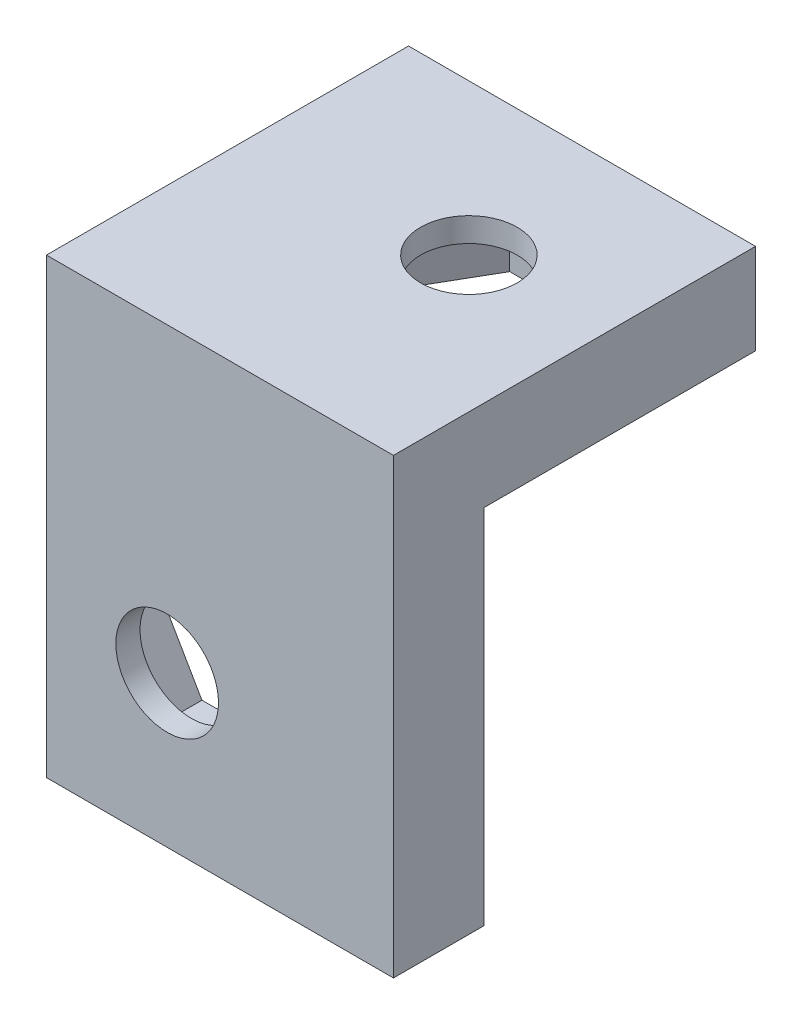
ISO-10303-21;
HEADER;
FILE_DESCRIPTION(('STEP AP214'),'2;1');
FILE_NAME('part.step','',(''),(''),'','','');
FILE_SCHEMA(('AUTOMOTIVE_DESIGN { 1 0 10303 214 1 1 1 1 }'));
ENDSEC;
DATA;
#1=APPLICATION_CONTEXT('core data for automotive mechanical design processes');
#2=APPLICATION_PROTOCOL_DEFINITION('international standard','automotive_design',2000,#1);
#3=PRODUCT_CONTEXT('',#1,'mechanical');
#4=PRODUCT('Part','Part','',(#3));
#5=PRODUCT_RELATED_PRODUCT_CATEGORY('part','',(#4));
#6=PRODUCT_DEFINITION_FORMATION('','',#4);
#7=PRODUCT_DEFINITION_CONTEXT('part definition',#1,'design');
#8=PRODUCT_DEFINITION('design','',#6,#7);
#9=PRODUCT_DEFINITION_SHAPE('','',#8);
#10=(LENGTH_UNIT() NAMED_UNIT(*) SI_UNIT(.MILLI.,.METRE.));
#11=(NAMED_UNIT(*) PLANE_ANGLE_UNIT() SI_UNIT($,.RADIAN.));
#12=(NAMED_UNIT(*) SI_UNIT($,.STERADIAN.) SOLID_ANGLE_UNIT());
#13=UNCERTAINTY_MEASURE_WITH_UNIT(LENGTH_MEASURE(1.E-05),#10,'distance_accuracy_value','');
#14=(GEOMETRIC_REPRESENTATION_CONTEXT(3) GLOBAL_UNCERTAINTY_ASSIGNED_CONTEXT((#13)) GLOBAL_UNIT_ASSIGNED_CONTEXT((#10,
#11,#12)) REPRESENTATION_CONTEXT('',''));
#15=CARTESIAN_POINT('',(0.,0.,0.));
#16=DIRECTION('',(0.,0.,1.));
#17=DIRECTION('',(1.,0.,0.));
#18=AXIS2_PLACEMENT_3D('',#15,#16,#17);
#19=CARTESIAN_POINT('',(0.,0.,0.));
#20=DIRECTION('',(0.,1.,0.));
#21=DIRECTION('',(0.,0.,1.));
#22=AXIS2_PLACEMENT_3D('',#19,#20,#21);
#23=PLANE('',#22);
#24=DIRECTION('',(1.,0.,0.));
#25=VECTOR('',#24,1.);
#26=CARTESIAN_POINT('',(0.,0.,-3.));
#27=LINE('',#26,#25);
#28=CARTESIAN_POINT('',(0.,0.,-3.));
#29=VERTEX_POINT('',#28);
#30=CARTESIAN_POINT('',(11.5,0.,-3.));
#31=VERTEX_POINT('',#30);
#32=EDGE_CURVE('E312',#29,#31,#27,.T.);
#33=ORIENTED_EDGE('',*,*,#32,.F.);
#34=DIRECTION('',(0.,0.,-1.));
#35=VECTOR('',#34,1.);
#36=CARTESIAN_POINT('',(0.,0.,0.));
#37=LINE('',#36,#35);
#38=CARTESIAN_POINT('',(0.,0.,-12.));
#39=VERTEX_POINT('',#38);
#40=EDGE_CURVE('E335',#29,#39,#37,.T.);
#41=ORIENTED_EDGE('',*,*,#40,.T.);
#42=DIRECTION('',(1.,0.,0.));
#43=VECTOR('',#42,1.);
#44=CARTESIAN_POINT('',(0.,0.,-12.));
#45=LINE('',#44,#43);
#46=CARTESIAN_POINT('',(11.5,0.,-12.));
#47=VERTEX_POINT('',#46);
#48=EDGE_CURVE('E344',#39,#47,#45,.T.);
#49=ORIENTED_EDGE('',*,*,#48,.T.);
#50=DIRECTION('',(0.,0.,-1.));
#51=VECTOR('',#50,1.);
#52=CARTESIAN_POINT('',(11.5,0.,0.));
#53=LINE('',#52,#51);
#54=EDGE_CURVE('E357',#31,#47,#53,.T.);
#55=ORIENTED_EDGE('',*,*,#54,.F.);
#56=EDGE_LOOP('',(#33,#41,#49,#55));
#57=FACE_BOUND('',#56,.T.);
#58=DIRECTION('',(0.5,0.,0.866025403784439));
#59=VECTOR('',#58,1.);
#60=CARTESIAN_POINT('',(5.50980762113533,0.,-3.18108891324554));
#61=LINE('',#60,#59);
#62=CARTESIAN_POINT('',(3.30495827718639,0.,-7.));
#63=VERTEX_POINT('',#62);
#64=CARTESIAN_POINT('',(5.1524791385932,0.,-3.8));
#65=VERTEX_POINT('',#64);
#66=EDGE_CURVE('E67',#63,#65,#61,.T.);
#67=ORIENTED_EDGE('',*,*,#66,.T.);
#68=DIRECTION('',(1.,0.,0.));
#69=VECTOR('',#68,1.);
#70=CARTESIAN_POINT('',(0.,0.,-3.8));
#71=LINE('',#70,#69);
#72=CARTESIAN_POINT('',(8.8475208614068,0.,-3.8));
#73=VERTEX_POINT('',#72);
#74=EDGE_CURVE('E276',#65,#73,#71,.T.);
#75=ORIENTED_EDGE('',*,*,#74,.T.);
#76=DIRECTION('',(0.5,0.,-0.866025403784439));
#77=VECTOR('',#76,1.);
#78=CARTESIAN_POINT('',(4.99019237886467,0.,2.88108891324554));
#79=LINE('',#78,#77);
#80=CARTESIAN_POINT('',(10.6950417228136,0.,-7.));
#81=VERTEX_POINT('',#80);
#82=EDGE_CURVE('E280',#73,#81,#79,.T.);
#83=ORIENTED_EDGE('',*,*,#82,.T.);
#84=DIRECTION('',(-0.5,0.,-0.866025403784439));
#85=VECTOR('',#84,1.);
#86=CARTESIAN_POINT('',(11.0523702053557,0.,-6.38108891324554));
#87=LINE('',#86,#85);
#88=CARTESIAN_POINT('',(8.8475208614068,0.,-10.2));
#89=VERTEX_POINT('',#88);
#90=EDGE_CURVE('E284',#81,#89,#87,.T.);
#91=ORIENTED_EDGE('',*,*,#90,.T.);
#92=DIRECTION('',(-1.,0.,0.));
#93=VECTOR('',#92,1.);
#94=CARTESIAN_POINT('',(0.,0.,-10.2));
#95=LINE('',#94,#93);
#96=CARTESIAN_POINT('',(5.1524791385932,0.,-10.2));
#97=VERTEX_POINT('',#96);
#98=EDGE_CURVE('E288',#89,#97,#95,.T.);
#99=ORIENTED_EDGE('',*,*,#98,.T.);
#100=DIRECTION('',(-0.5,0.,0.866025403784439));
#101=VECTOR('',#100,1.);
#102=CARTESIAN_POINT('',(-0.552370205355739,0.,-0.318911086754464));
#103=LINE('',#102,#101);
#104=EDGE_CURVE('E258',#97,#63,#103,.T.);
#105=ORIENTED_EDGE('',*,*,#104,.T.);
#106=EDGE_LOOP('',(#67,#75,#83,#91,#99,#105));
#107=FACE_BOUND('',#106,.T.);
#108=ADVANCED_FACE('F43',(#57,#107),#23,.F.);
#109=CARTESIAN_POINT('',(0.,3.,0.));
#110=DIRECTION('',(-1.,0.,0.));
#111=DIRECTION('',(0.,0.,1.));
#112=AXIS2_PLACEMENT_3D('',#109,#110,#111);
#113=PLANE('',#112);
#114=ORIENTED_EDGE('',*,*,#40,.F.);
#115=DIRECTION('',(0.,1.,0.));
#116=VECTOR('',#115,1.);
#117=CARTESIAN_POINT('',(0.,-12.,-3.));
#118=LINE('',#117,#116);
#119=CARTESIAN_POINT('',(0.,-12.,-3.));
#120=VERTEX_POINT('',#119);
#121=EDGE_CURVE('E327',#120,#29,#118,.T.);
#122=ORIENTED_EDGE('',*,*,#121,.F.);
#123=DIRECTION('',(0.,0.,-1.));
#124=VECTOR('',#123,1.);
#125=CARTESIAN_POINT('',(0.,-12.,0.));
#126=LINE('',#125,#124);
#127=CARTESIAN_POINT('',(0.,-12.,0.));
#128=VERTEX_POINT('',#127);
#129=EDGE_CURVE('E316',#128,#120,#126,.T.);
#130=ORIENTED_EDGE('',*,*,#129,.F.);
#131=DIRECTION('',(0.,-1.,0.));
#132=VECTOR('',#131,1.);
#133=CARTESIAN_POINT('',(0.,3.,0.));
#134=LINE('',#133,#132);
#135=CARTESIAN_POINT('',(0.,3.,0.));
#136=VERTEX_POINT('',#135);
#137=EDGE_CURVE('E11',#136,#128,#134,.T.);
#138=ORIENTED_EDGE('',*,*,#137,.F.);
#139=DIRECTION('',(0.,0.,-1.));
#140=VECTOR('',#139,1.);
#141=CARTESIAN_POINT('',(0.,3.,0.));
#142=LINE('',#141,#140);
#143=CARTESIAN_POINT('',(0.,3.,-12.));
#144=VERTEX_POINT('',#143);
#145=EDGE_CURVE('E339',#136,#144,#142,.T.);
#146=ORIENTED_EDGE('',*,*,#145,.T.);
#147=DIRECTION('',(0.,-1.,0.));
#148=VECTOR('',#147,1.);
#149=CARTESIAN_POINT('',(0.,3.,-12.));
#150=LINE('',#149,#148);
#151=EDGE_CURVE('E354',#144,#39,#150,.T.);
#152=ORIENTED_EDGE('',*,*,#151,.T.);
#153=EDGE_LOOP('',(#114,#122,#130,#138,#146,#152));
#154=FACE_BOUND('',#153,.T.);
#155=ADVANCED_FACE('F45',(#154),#113,.T.);
#156=CARTESIAN_POINT('',(0.,3.,0.));
#157=DIRECTION('',(0.,0.,-1.));
#158=DIRECTION('',(-1.,0.,0.));
#159=AXIS2_PLACEMENT_3D('',#156,#157,#158);
#160=PLANE('',#159);
#161=CARTESIAN_POINT('',(4.,-7.,0.));
#162=DIRECTION('',(0.,0.,-1.));
#163=DIRECTION('',(-1.,0.,0.));
#164=AXIS2_PLACEMENT_3D('',#161,#162,#163);
#165=CIRCLE('',#164,1.7);
#166=CARTESIAN_POINT('',(2.3,-7.,0.));
#167=VERTEX_POINT('',#166);
#168=EDGE_CURVE('E423',#167,#167,#165,.T.);
#169=ORIENTED_EDGE('',*,*,#168,.T.);
#170=EDGE_LOOP('',(#169));
#171=FACE_BOUND('',#170,.T.);
#172=ORIENTED_EDGE('',*,*,#137,.T.);
#173=DIRECTION('',(1.,0.,0.));
#174=VECTOR('',#173,1.);
#175=CARTESIAN_POINT('',(0.,-12.,0.));
#176=LINE('',#175,#174);
#177=CARTESIAN_POINT('',(11.5,-12.,0.));
#178=VERTEX_POINT('',#177);
#179=EDGE_CURVE('E319',#128,#178,#176,.T.);
#180=ORIENTED_EDGE('',*,*,#179,.T.);
#181=DIRECTION('',(0.,-1.,0.));
#182=VECTOR('',#181,1.);
#183=CARTESIAN_POINT('',(11.5,3.,0.));
#184=LINE('',#183,#182);
#185=CARTESIAN_POINT('',(11.5,3.,0.));
#186=VERTEX_POINT('',#185);
#187=EDGE_CURVE('E52',#186,#178,#184,.T.);
#188=ORIENTED_EDGE('',*,*,#187,.F.);
#189=DIRECTION('',(1.,0.,0.));
#190=VECTOR('',#189,1.);
#191=CARTESIAN_POINT('',(0.,3.,0.));
#192=LINE('',#191,#190);
#193=EDGE_CURVE('E343',#136,#186,#192,.T.);
#194=ORIENTED_EDGE('',*,*,#193,.F.);
#195=EDGE_LOOP('',(#172,#180,#188,#194));
#196=FACE_BOUND('',#195,.T.);
#197=ADVANCED_FACE('F379',(#171,#196),#160,.F.);
#198=CARTESIAN_POINT('',(11.5,3.,0.));
#199=DIRECTION('',(-1.,0.,0.));
#200=DIRECTION('',(0.,0.,1.));
#201=AXIS2_PLACEMENT_3D('',#198,#199,#200);
#202=PLANE('',#201);
#203=ORIENTED_EDGE('',*,*,#187,.T.);
#204=DIRECTION('',(0.,0.,-1.));
#205=VECTOR('',#204,1.);
#206=CARTESIAN_POINT('',(11.5,-12.,0.));
#207=LINE('',#206,#205);
#208=CARTESIAN_POINT('',(11.5,-12.,-3.));
#209=VERTEX_POINT('',#208);
#210=EDGE_CURVE('E323',#178,#209,#207,.T.);
#211=ORIENTED_EDGE('',*,*,#210,.T.);
#212=DIRECTION('',(0.,1.,0.));
#213=VECTOR('',#212,1.);
#214=CARTESIAN_POINT('',(11.5,-12.,-3.));
#215=LINE('',#214,#213);
#216=EDGE_CURVE('E331',#209,#31,#215,.T.);
#217=ORIENTED_EDGE('',*,*,#216,.T.);
#218=ORIENTED_EDGE('',*,*,#54,.T.);
#219=DIRECTION('',(0.,-1.,0.));
#220=VECTOR('',#219,1.);
#221=CARTESIAN_POINT('',(11.5,3.,-12.));
#222=LINE('',#221,#220);
#223=CARTESIAN_POINT('',(11.5,3.,-12.));
#224=VERTEX_POINT('',#223);
#225=EDGE_CURVE('E366',#224,#47,#222,.T.);
#226=ORIENTED_EDGE('',*,*,#225,.F.);
#227=DIRECTION('',(0.,0.,-1.));
#228=VECTOR('',#227,1.);
#229=CARTESIAN_POINT('',(11.5,3.,0.));
#230=LINE('',#229,#228);
#231=EDGE_CURVE('E347',#186,#224,#230,.T.);
#232=ORIENTED_EDGE('',*,*,#231,.F.);
#233=EDGE_LOOP('',(#203,#211,#217,#218,#226,#232));
#234=FACE_BOUND('',#233,.T.);
#235=ADVANCED_FACE('F373',(#234),#202,.F.);
#236=CARTESIAN_POINT('',(0.,3.,-12.));
#237=DIRECTION('',(0.,0.,-1.));
#238=DIRECTION('',(-1.,0.,0.));
#239=AXIS2_PLACEMENT_3D('',#236,#237,#238);
#240=PLANE('',#239);
#241=ORIENTED_EDGE('',*,*,#48,.F.);
#242=ORIENTED_EDGE('',*,*,#151,.F.);
#243=DIRECTION('',(1.,0.,0.));
#244=VECTOR('',#243,1.);
#245=CARTESIAN_POINT('',(0.,3.,-12.));
#246=LINE('',#245,#244);
#247=EDGE_CURVE('E350',#144,#224,#246,.T.);
#248=ORIENTED_EDGE('',*,*,#247,.T.);
#249=ORIENTED_EDGE('',*,*,#225,.T.);
#250=EDGE_LOOP('',(#241,#242,#248,#249));
#251=FACE_BOUND('',#250,.T.);
#252=ADVANCED_FACE('F391',(#251),#240,.T.);
#253=CARTESIAN_POINT('',(0.,3.,0.));
#254=DIRECTION('',(0.,1.,0.));
#255=DIRECTION('',(0.,0.,1.));
#256=AXIS2_PLACEMENT_3D('',#253,#254,#255);
#257=PLANE('',#256);
#258=CARTESIAN_POINT('',(7.,3.,-7.));
#259=DIRECTION('',(0.,1.,0.));
#260=DIRECTION('',(0.,0.,1.));
#261=AXIS2_PLACEMENT_3D('',#258,#259,#260);
#262=CIRCLE('',#261,1.6);
#263=CARTESIAN_POINT('',(7.,3.,-5.4));
#264=VERTEX_POINT('',#263);
#265=EDGE_CURVE('E234',#264,#264,#262,.T.);
#266=ORIENTED_EDGE('',*,*,#265,.F.);
#267=EDGE_LOOP('',(#266));
#268=FACE_BOUND('',#267,.T.);
#269=ORIENTED_EDGE('',*,*,#145,.F.);
#270=ORIENTED_EDGE('',*,*,#193,.T.);
#271=ORIENTED_EDGE('',*,*,#231,.T.);
#272=ORIENTED_EDGE('',*,*,#247,.F.);
#273=EDGE_LOOP('',(#269,#270,#271,#272));
#274=FACE_BOUND('',#273,.T.);
#275=ADVANCED_FACE('F398',(#268,#274),#257,.T.);
#276=CARTESIAN_POINT('',(0.,-12.,-3.));
#277=DIRECTION('',(0.,0.,1.));
#278=DIRECTION('',(1.,0.,0.));
#279=AXIS2_PLACEMENT_3D('',#276,#277,#278);
#280=PLANE('',#279);
#281=DIRECTION('',(-0.5,-0.866025403784439,0.));
#282=VECTOR('',#281,1.);
#283=CARTESIAN_POINT('',(8.80237020535574,-5.08205080756888,-3.));
#284=LINE('',#283,#282);
#285=CARTESIAN_POINT('',(7.69504172281361,-7.,-3.));
#286=VERTEX_POINT('',#285);
#287=CARTESIAN_POINT('',(5.84752086140681,-10.2,-3.));
#288=VERTEX_POINT('',#287);
#289=EDGE_CURVE('E217',#286,#288,#284,.T.);
#290=ORIENTED_EDGE('',*,*,#289,.F.);
#291=DIRECTION('',(0.5,-0.866025403784439,0.));
#292=VECTOR('',#291,1.);
#293=CARTESIAN_POINT('',(2.74019237886467,1.58205080756888,-3.));
#294=LINE('',#293,#292);
#295=CARTESIAN_POINT('',(5.8475208614068,-3.8,-3.));
#296=VERTEX_POINT('',#295);
#297=EDGE_CURVE('E59',#296,#286,#294,.T.);
#298=ORIENTED_EDGE('',*,*,#297,.F.);
#299=DIRECTION('',(1.,0.,0.));
#300=VECTOR('',#299,1.);
#301=CARTESIAN_POINT('',(0.,-3.79999999999999,-3.));
#302=LINE('',#301,#300);
#303=CARTESIAN_POINT('',(2.1524791385932,-3.8,-3.));
#304=VERTEX_POINT('',#303);
#305=EDGE_CURVE('E194',#304,#296,#302,.T.);
#306=ORIENTED_EDGE('',*,*,#305,.F.);
#307=DIRECTION('',(0.5,0.866025403784438,0.));
#308=VECTOR('',#307,1.);
#309=CARTESIAN_POINT('',(3.25980762113533,-1.88205080756888,-3.));
#310=LINE('',#309,#308);
#311=CARTESIAN_POINT('',(0.304958277186393,-7.,-3.));
#312=VERTEX_POINT('',#311);
#313=EDGE_CURVE('E198',#312,#304,#310,.T.);
#314=ORIENTED_EDGE('',*,*,#313,.F.);
#315=DIRECTION('',(-0.5,0.866025403784439,0.));
#316=VECTOR('',#315,1.);
#317=CARTESIAN_POINT('',(-2.80237020535574,-1.61794919243112,-3.));
#318=LINE('',#317,#316);
#319=CARTESIAN_POINT('',(2.1524791385932,-10.2,-3.));
#320=VERTEX_POINT('',#319);
#321=EDGE_CURVE('E224',#320,#312,#318,.T.);
#322=ORIENTED_EDGE('',*,*,#321,.F.);
#323=DIRECTION('',(-1.,0.,0.));
#324=VECTOR('',#323,1.);
#325=CARTESIAN_POINT('',(0.,-10.2,-3.));
#326=LINE('',#325,#324);
#327=EDGE_CURVE('E220',#288,#320,#326,.T.);
#328=ORIENTED_EDGE('',*,*,#327,.F.);
#329=EDGE_LOOP('',(#290,#298,#306,#314,#322,#328));
#330=FACE_BOUND('',#329,.T.);
#331=ORIENTED_EDGE('',*,*,#32,.T.);
#332=ORIENTED_EDGE('',*,*,#216,.F.);
#333=DIRECTION('',(1.,0.,0.));
#334=VECTOR('',#333,1.);
#335=CARTESIAN_POINT('',(0.,-12.,-3.));
#336=LINE('',#335,#334);
#337=EDGE_CURVE('E313',#120,#209,#336,.T.);
#338=ORIENTED_EDGE('',*,*,#337,.F.);
#339=ORIENTED_EDGE('',*,*,#121,.T.);
#340=EDGE_LOOP('',(#331,#332,#338,#339));
#341=FACE_BOUND('',#340,.T.);
#342=ADVANCED_FACE('F387',(#330,#341),#280,.F.);
#343=CARTESIAN_POINT('',(0.,-12.,0.));
#344=DIRECTION('',(0.,1.,0.));
#345=DIRECTION('',(0.,0.,1.));
#346=AXIS2_PLACEMENT_3D('',#343,#344,#345);
#347=PLANE('',#346);
#348=ORIENTED_EDGE('',*,*,#337,.T.);
#349=ORIENTED_EDGE('',*,*,#210,.F.);
#350=ORIENTED_EDGE('',*,*,#179,.F.);
#351=ORIENTED_EDGE('',*,*,#129,.T.);
#352=EDGE_LOOP('',(#348,#349,#350,#351));
#353=FACE_BOUND('',#352,.T.);
#354=ADVANCED_FACE('F382',(#353),#347,.F.);
#355=CARTESIAN_POINT('',(5.50980762113533,2.2,-3.18108891324554));
#356=DIRECTION('',(0.866025403784439,0.,-0.5));
#357=DIRECTION('',(-0.5,0.,-0.866025403784439));
#358=AXIS2_PLACEMENT_3D('',#355,#356,#357);
#359=PLANE('',#358);
#360=ORIENTED_EDGE('',*,*,#66,.F.);
#361=DIRECTION('',(0.,-1.,0.));
#362=VECTOR('',#361,1.);
#363=CARTESIAN_POINT('',(3.30495827718639,2.2,-7.));
#364=LINE('',#363,#362);
#365=CARTESIAN_POINT('',(3.30495827718639,2.2,-7.));
#366=VERTEX_POINT('',#365);
#367=EDGE_CURVE('E273',#366,#63,#364,.T.);
#368=ORIENTED_EDGE('',*,*,#367,.F.);
#369=DIRECTION('',(0.5,0.,0.866025403784439));
#370=VECTOR('',#369,1.);
#371=CARTESIAN_POINT('',(5.50980762113533,2.2,-3.18108891324554));
#372=LINE('',#371,#370);
#373=CARTESIAN_POINT('',(5.1524791385932,2.2,-3.8));
#374=VERTEX_POINT('',#373);
#375=EDGE_CURVE('E253',#366,#374,#372,.T.);
#376=ORIENTED_EDGE('',*,*,#375,.T.);
#377=DIRECTION('',(0.,-1.,0.));
#378=VECTOR('',#377,1.);
#379=CARTESIAN_POINT('',(5.1524791385932,2.2,-3.8));
#380=LINE('',#379,#378);
#381=EDGE_CURVE('E309',#374,#65,#380,.T.);
#382=ORIENTED_EDGE('',*,*,#381,.T.);
#383=EDGE_LOOP('',(#360,#368,#376,#382));
#384=FACE_BOUND('',#383,.T.);
#385=ADVANCED_FACE('F486',(#384),#359,.T.);
#386=CARTESIAN_POINT('',(0.,2.2,-3.8));
#387=DIRECTION('',(0.,0.,-1.));
#388=DIRECTION('',(-1.,0.,0.));
#389=AXIS2_PLACEMENT_3D('',#386,#387,#388);
#390=PLANE('',#389);
#391=ORIENTED_EDGE('',*,*,#74,.F.);
#392=ORIENTED_EDGE('',*,*,#381,.F.);
#393=DIRECTION('',(1.,0.,0.));
#394=VECTOR('',#393,1.);
#395=CARTESIAN_POINT('',(0.,2.2,-3.8));
#396=LINE('',#395,#394);
#397=CARTESIAN_POINT('',(8.8475208614068,2.2,-3.8));
#398=VERTEX_POINT('',#397);
#399=EDGE_CURVE('E257',#374,#398,#396,.T.);
#400=ORIENTED_EDGE('',*,*,#399,.T.);
#401=DIRECTION('',(0.,-1.,0.));
#402=VECTOR('',#401,1.);
#403=CARTESIAN_POINT('',(8.8475208614068,2.2,-3.8));
#404=LINE('',#403,#402);
#405=EDGE_CURVE('E306',#398,#73,#404,.T.);
#406=ORIENTED_EDGE('',*,*,#405,.T.);
#407=EDGE_LOOP('',(#391,#392,#400,#406));
#408=FACE_BOUND('',#407,.T.);
#409=ADVANCED_FACE('F482',(#408),#390,.T.);
#410=CARTESIAN_POINT('',(4.99019237886467,2.2,2.88108891324554));
#411=DIRECTION('',(-0.866025403784439,0.,-0.5));
#412=DIRECTION('',(-0.5,0.,0.866025403784439));
#413=AXIS2_PLACEMENT_3D('',#410,#411,#412);
#414=PLANE('',#413);
#415=ORIENTED_EDGE('',*,*,#82,.F.);
#416=ORIENTED_EDGE('',*,*,#405,.F.);
#417=DIRECTION('',(0.5,0.,-0.866025403784439));
#418=VECTOR('',#417,1.);
#419=CARTESIAN_POINT('',(4.99019237886467,2.2,2.88108891324554));
#420=LINE('',#419,#418);
#421=CARTESIAN_POINT('',(10.6950417228136,2.2,-7.));
#422=VERTEX_POINT('',#421);
#423=EDGE_CURVE('E261',#398,#422,#420,.T.);
#424=ORIENTED_EDGE('',*,*,#423,.T.);
#425=DIRECTION('',(0.,-1.,0.));
#426=VECTOR('',#425,1.);
#427=CARTESIAN_POINT('',(10.6950417228136,2.2,-7.));
#428=LINE('',#427,#426);
#429=EDGE_CURVE('E303',#422,#81,#428,.T.);
#430=ORIENTED_EDGE('',*,*,#429,.T.);
#431=EDGE_LOOP('',(#415,#416,#424,#430));
#432=FACE_BOUND('',#431,.T.);
#433=ADVANCED_FACE('F478',(#432),#414,.T.);
#434=CARTESIAN_POINT('',(11.0523702053557,2.2,-6.38108891324554));
#435=DIRECTION('',(-0.866025403784439,0.,0.5));
#436=DIRECTION('',(0.5,0.,0.866025403784439));
#437=AXIS2_PLACEMENT_3D('',#434,#435,#436);
#438=PLANE('',#437);
#439=ORIENTED_EDGE('',*,*,#90,.F.);
#440=ORIENTED_EDGE('',*,*,#429,.F.);
#441=DIRECTION('',(-0.5,0.,-0.866025403784439));
#442=VECTOR('',#441,1.);
#443=CARTESIAN_POINT('',(11.0523702053557,2.2,-6.38108891324554));
#444=LINE('',#443,#442);
#445=CARTESIAN_POINT('',(8.8475208614068,2.2,-10.2));
#446=VERTEX_POINT('',#445);
#447=EDGE_CURVE('E264',#422,#446,#444,.T.);
#448=ORIENTED_EDGE('',*,*,#447,.T.);
#449=DIRECTION('',(0.,-1.,0.));
#450=VECTOR('',#449,1.);
#451=CARTESIAN_POINT('',(8.8475208614068,2.2,-10.2));
#452=LINE('',#451,#450);
#453=EDGE_CURVE('E300',#446,#89,#452,.T.);
#454=ORIENTED_EDGE('',*,*,#453,.T.);
#455=EDGE_LOOP('',(#439,#440,#448,#454));
#456=FACE_BOUND('',#455,.T.);
#457=ADVANCED_FACE('F474',(#456),#438,.T.);
#458=CARTESIAN_POINT('',(0.,2.2,-10.2));
#459=DIRECTION('',(0.,0.,1.));
#460=DIRECTION('',(1.,0.,0.));
#461=AXIS2_PLACEMENT_3D('',#458,#459,#460);
#462=PLANE('',#461);
#463=ORIENTED_EDGE('',*,*,#98,.F.);
#464=ORIENTED_EDGE('',*,*,#453,.F.);
#465=DIRECTION('',(-1.,0.,0.));
#466=VECTOR('',#465,1.);
#467=CARTESIAN_POINT('',(0.,2.2,-10.2));
#468=LINE('',#467,#466);
#469=CARTESIAN_POINT('',(5.1524791385932,2.2,-10.2));
#470=VERTEX_POINT('',#469);
#471=EDGE_CURVE('E267',#446,#470,#468,.T.);
#472=ORIENTED_EDGE('',*,*,#471,.T.);
#473=DIRECTION('',(0.,-1.,0.));
#474=VECTOR('',#473,1.);
#475=CARTESIAN_POINT('',(5.1524791385932,2.2,-10.2));
#476=LINE('',#475,#474);
#477=EDGE_CURVE('E297',#470,#97,#476,.T.);
#478=ORIENTED_EDGE('',*,*,#477,.T.);
#479=EDGE_LOOP('',(#463,#464,#472,#478));
#480=FACE_BOUND('',#479,.T.);
#481=ADVANCED_FACE('F470',(#480),#462,.T.);
#482=CARTESIAN_POINT('',(-0.552370205355739,2.2,-0.318911086754464));
#483=DIRECTION('',(0.866025403784439,0.,0.5));
#484=DIRECTION('',(0.5,0.,-0.866025403784439));
#485=AXIS2_PLACEMENT_3D('',#482,#483,#484);
#486=PLANE('',#485);
#487=ORIENTED_EDGE('',*,*,#104,.F.);
#488=ORIENTED_EDGE('',*,*,#477,.F.);
#489=DIRECTION('',(-0.5,0.,0.866025403784439));
#490=VECTOR('',#489,1.);
#491=CARTESIAN_POINT('',(-0.552370205355739,2.2,-0.318911086754464));
#492=LINE('',#491,#490);
#493=EDGE_CURVE('E270',#470,#366,#492,.T.);
#494=ORIENTED_EDGE('',*,*,#493,.T.);
#495=ORIENTED_EDGE('',*,*,#367,.T.);
#496=EDGE_LOOP('',(#487,#488,#494,#495));
#497=FACE_BOUND('',#496,.T.);
#498=ADVANCED_FACE('F466',(#497),#486,.T.);
#499=CARTESIAN_POINT('',(0.,2.2,0.));
#500=DIRECTION('',(0.,1.,0.));
#501=DIRECTION('',(0.,0.,1.));
#502=AXIS2_PLACEMENT_3D('',#499,#500,#501);
#503=PLANE('',#502);
#504=CARTESIAN_POINT('',(7.,2.2,-7.));
#505=DIRECTION('',(0.,1.,0.));
#506=DIRECTION('',(0.,0.,1.));
#507=AXIS2_PLACEMENT_3D('',#504,#505,#506);
#508=CIRCLE('',#507,1.6);
#509=CARTESIAN_POINT('',(7.,2.2,-5.4));
#510=VERTEX_POINT('',#509);
#511=EDGE_CURVE('E249',#510,#510,#508,.F.);
#512=ORIENTED_EDGE('',*,*,#511,.F.);
#513=EDGE_LOOP('',(#512));
#514=FACE_BOUND('',#513,.T.);
#515=ORIENTED_EDGE('',*,*,#375,.F.);
#516=ORIENTED_EDGE('',*,*,#493,.F.);
#517=ORIENTED_EDGE('',*,*,#471,.F.);
#518=ORIENTED_EDGE('',*,*,#447,.F.);
#519=ORIENTED_EDGE('',*,*,#423,.F.);
#520=ORIENTED_EDGE('',*,*,#399,.F.);
#521=EDGE_LOOP('',(#515,#516,#517,#518,#519,#520));
#522=FACE_BOUND('',#521,.T.);
#523=ADVANCED_FACE('F462',(#514,#522),#503,.F.);
#524=CARTESIAN_POINT('',(7.,3.,-7.));
#525=DIRECTION('',(0.,-1.,0.));
#526=DIRECTION('',(0.,0.,-1.));
#527=AXIS2_PLACEMENT_3D('',#524,#525,#526);
#528=CYLINDRICAL_SURFACE('',#527,1.6);
#529=ORIENTED_EDGE('',*,*,#265,.T.);
#530=EDGE_LOOP('',(#529));
#531=FACE_BOUND('',#530,.T.);
#532=ORIENTED_EDGE('',*,*,#511,.T.);
#533=EDGE_LOOP('',(#532));
#534=FACE_BOUND('',#533,.T.);
#535=ADVANCED_FACE('F459',(#531,#534),#528,.F.);
#536=CARTESIAN_POINT('',(2.74019237886467,1.58205080756888,-0.8));
#537=DIRECTION('',(0.866025403784439,0.5,0.));
#538=DIRECTION('',(-0.5,0.866025403784439,0.));
#539=AXIS2_PLACEMENT_3D('',#536,#537,#538);
#540=PLANE('',#539);
#541=ORIENTED_EDGE('',*,*,#297,.T.);
#542=DIRECTION('',(0.,0.,-1.));
#543=VECTOR('',#542,1.);
#544=CARTESIAN_POINT('',(7.69504172281361,-7.,-0.8));
#545=LINE('',#544,#543);
#546=CARTESIAN_POINT('',(7.69504172281361,-7.,-0.8));
#547=VERTEX_POINT('',#546);
#548=EDGE_CURVE('E168',#547,#286,#545,.T.);
#549=ORIENTED_EDGE('',*,*,#548,.F.);
#550=DIRECTION('',(0.5,-0.866025403784439,0.));
#551=VECTOR('',#550,1.);
#552=CARTESIAN_POINT('',(2.74019237886467,1.58205080756888,-0.8));
#553=LINE('',#552,#551);
#554=CARTESIAN_POINT('',(5.8475208614068,-3.8,-0.8));
#555=VERTEX_POINT('',#554);
#556=EDGE_CURVE('E172',#555,#547,#553,.T.);
#557=ORIENTED_EDGE('',*,*,#556,.F.);
#558=DIRECTION('',(0.,0.,-1.));
#559=VECTOR('',#558,1.);
#560=CARTESIAN_POINT('',(5.8475208614068,-3.8,-0.8));
#561=LINE('',#560,#559);
#562=EDGE_CURVE('E231',#555,#296,#561,.T.);
#563=ORIENTED_EDGE('',*,*,#562,.T.);
#564=EDGE_LOOP('',(#541,#549,#557,#563));
#565=FACE_BOUND('',#564,.T.);
#566=ADVANCED_FACE('F170',(#565),#540,.F.);
#567=CARTESIAN_POINT('',(0.,-3.79999999999999,-0.8));
#568=DIRECTION('',(0.,1.,0.));
#569=DIRECTION('',(-1.,0.,0.));
#570=AXIS2_PLACEMENT_3D('',#567,#568,#569);
#571=PLANE('',#570);
#572=ORIENTED_EDGE('',*,*,#305,.T.);
#573=ORIENTED_EDGE('',*,*,#562,.F.);
#574=DIRECTION('',(1.,0.,0.));
#575=VECTOR('',#574,1.);
#576=CARTESIAN_POINT('',(0.,-3.79999999999999,-0.8));
#577=LINE('',#576,#575);
#578=CARTESIAN_POINT('',(2.1524791385932,-3.8,-0.8));
#579=VERTEX_POINT('',#578);
#580=EDGE_CURVE('E179',#579,#555,#577,.T.);
#581=ORIENTED_EDGE('',*,*,#580,.F.);
#582=DIRECTION('',(0.,0.,-1.));
#583=VECTOR('',#582,1.);
#584=CARTESIAN_POINT('',(2.1524791385932,-3.8,-0.8));
#585=LINE('',#584,#583);
#586=EDGE_CURVE('E235',#579,#304,#585,.T.);
#587=ORIENTED_EDGE('',*,*,#586,.T.);
#588=EDGE_LOOP('',(#572,#573,#581,#587));
#589=FACE_BOUND('',#588,.T.);
#590=ADVANCED_FACE('F442',(#589),#571,.F.);
#591=CARTESIAN_POINT('',(3.25980762113533,-1.88205080756888,-0.8));
#592=DIRECTION('',(-0.866025403784438,0.5,0.));
#593=DIRECTION('',(-0.5,-0.866025403784438,0.));
#594=AXIS2_PLACEMENT_3D('',#591,#592,#593);
#595=PLANE('',#594);
#596=ORIENTED_EDGE('',*,*,#313,.T.);
#597=ORIENTED_EDGE('',*,*,#586,.F.);
#598=DIRECTION('',(0.5,0.866025403784438,0.));
#599=VECTOR('',#598,1.);
#600=CARTESIAN_POINT('',(3.25980762113533,-1.88205080756888,-0.8));
#601=LINE('',#600,#599);
#602=CARTESIAN_POINT('',(0.304958277186393,-7.,-0.8));
#603=VERTEX_POINT('',#602);
#604=EDGE_CURVE('E210',#603,#579,#601,.T.);
#605=ORIENTED_EDGE('',*,*,#604,.F.);
#606=DIRECTION('',(0.,0.,-1.));
#607=VECTOR('',#606,1.);
#608=CARTESIAN_POINT('',(0.304958277186393,-7.,-0.8));
#609=LINE('',#608,#607);
#610=EDGE_CURVE('E238',#603,#312,#609,.T.);
#611=ORIENTED_EDGE('',*,*,#610,.T.);
#612=EDGE_LOOP('',(#596,#597,#605,#611));
#613=FACE_BOUND('',#612,.T.);
#614=ADVANCED_FACE('F445',(#613),#595,.F.);
#615=CARTESIAN_POINT('',(-2.80237020535574,-1.61794919243112,-0.8));
#616=DIRECTION('',(-0.866025403784438,-0.5,0.));
#617=DIRECTION('',(0.5,-0.866025403784439,0.));
#618=AXIS2_PLACEMENT_3D('',#615,#616,#617);
#619=PLANE('',#618);
#620=ORIENTED_EDGE('',*,*,#321,.T.);
#621=ORIENTED_EDGE('',*,*,#610,.F.);
#622=DIRECTION('',(-0.5,0.866025403784439,0.));
#623=VECTOR('',#622,1.);
#624=CARTESIAN_POINT('',(-2.80237020535574,-1.61794919243112,-0.8));
#625=LINE('',#624,#623);
#626=CARTESIAN_POINT('',(2.1524791385932,-10.2,-0.8));
#627=VERTEX_POINT('',#626);
#628=EDGE_CURVE('E206',#627,#603,#625,.T.);
#629=ORIENTED_EDGE('',*,*,#628,.F.);
#630=DIRECTION('',(0.,0.,-1.));
#631=VECTOR('',#630,1.);
#632=CARTESIAN_POINT('',(2.1524791385932,-10.2,-0.8));
#633=LINE('',#632,#631);
#634=EDGE_CURVE('E241',#627,#320,#633,.T.);
#635=ORIENTED_EDGE('',*,*,#634,.T.);
#636=EDGE_LOOP('',(#620,#621,#629,#635));
#637=FACE_BOUND('',#636,.T.);
#638=ADVANCED_FACE('F449',(#637),#619,.F.);
#639=CARTESIAN_POINT('',(0.,-10.2,-0.8));
#640=DIRECTION('',(0.,-1.,0.));
#641=DIRECTION('',(1.,0.,0.));
#642=AXIS2_PLACEMENT_3D('',#639,#640,#641);
#643=PLANE('',#642);
#644=ORIENTED_EDGE('',*,*,#327,.T.);
#645=ORIENTED_EDGE('',*,*,#634,.F.);
#646=DIRECTION('',(-1.,0.,0.));
#647=VECTOR('',#646,1.);
#648=CARTESIAN_POINT('',(0.,-10.2,-0.8));
#649=LINE('',#648,#647);
#650=CARTESIAN_POINT('',(5.84752086140681,-10.2,-0.8));
#651=VERTEX_POINT('',#650);
#652=EDGE_CURVE('E188',#651,#627,#649,.T.);
#653=ORIENTED_EDGE('',*,*,#652,.F.);
#654=DIRECTION('',(0.,0.,-1.));
#655=VECTOR('',#654,1.);
#656=CARTESIAN_POINT('',(5.84752086140681,-10.2,-0.8));
#657=LINE('',#656,#655);
#658=EDGE_CURVE('E178',#651,#288,#657,.T.);
#659=ORIENTED_EDGE('',*,*,#658,.T.);
#660=EDGE_LOOP('',(#644,#645,#653,#659));
#661=FACE_BOUND('',#660,.T.);
#662=ADVANCED_FACE('F439',(#661),#643,.F.);
#663=CARTESIAN_POINT('',(8.80237020535574,-5.08205080756888,-0.8));
#664=DIRECTION('',(0.866025403784438,-0.5,0.));
#665=DIRECTION('',(0.5,0.866025403784439,0.));
#666=AXIS2_PLACEMENT_3D('',#663,#664,#665);
#667=PLANE('',#666);
#668=ORIENTED_EDGE('',*,*,#289,.T.);
#669=ORIENTED_EDGE('',*,*,#658,.F.);
#670=DIRECTION('',(-0.5,-0.866025403784439,0.));
#671=VECTOR('',#670,1.);
#672=CARTESIAN_POINT('',(8.80237020535574,-5.08205080756888,-0.8));
#673=LINE('',#672,#671);
#674=EDGE_CURVE('E182',#547,#651,#673,.T.);
#675=ORIENTED_EDGE('',*,*,#674,.F.);
#676=ORIENTED_EDGE('',*,*,#548,.T.);
#677=EDGE_LOOP('',(#668,#669,#675,#676));
#678=FACE_BOUND('',#677,.T.);
#679=ADVANCED_FACE('F183',(#678),#667,.F.);
#680=CARTESIAN_POINT('',(0.,0.,-0.8));
#681=DIRECTION('',(0.,0.,-1.));
#682=DIRECTION('',(-1.,0.,0.));
#683=AXIS2_PLACEMENT_3D('',#680,#681,#682);
#684=PLANE('',#683);
#685=CARTESIAN_POINT('',(4.,-7.,-0.8));
#686=DIRECTION('',(0.,0.,-1.));
#687=DIRECTION('',(-1.,0.,0.));
#688=AXIS2_PLACEMENT_3D('',#685,#686,#687);
#689=CIRCLE('',#688,1.7);
#690=CARTESIAN_POINT('',(2.3,-7.,-0.8));
#691=VERTEX_POINT('',#690);
#692=EDGE_CURVE('E201',#691,#691,#689,.T.);
#693=ORIENTED_EDGE('',*,*,#692,.F.);
#694=EDGE_LOOP('',(#693));
#695=FACE_BOUND('',#694,.T.);
#696=ORIENTED_EDGE('',*,*,#556,.T.);
#697=ORIENTED_EDGE('',*,*,#674,.T.);
#698=ORIENTED_EDGE('',*,*,#652,.T.);
#699=ORIENTED_EDGE('',*,*,#628,.T.);
#700=ORIENTED_EDGE('',*,*,#604,.T.);
#701=ORIENTED_EDGE('',*,*,#580,.T.);
#702=EDGE_LOOP('',(#696,#697,#698,#699,#700,#701));
#703=FACE_BOUND('',#702,.T.);
#704=ADVANCED_FACE('F190',(#695,#703),#684,.T.);
#705=CARTESIAN_POINT('',(4.,-7.,0.));
#706=DIRECTION('',(0.,0.,-1.));
#707=DIRECTION('',(-1.,0.,0.));
#708=AXIS2_PLACEMENT_3D('',#705,#706,#707);
#709=CYLINDRICAL_SURFACE('',#708,1.7);
#710=ORIENTED_EDGE('',*,*,#692,.T.);
#711=EDGE_LOOP('',(#710));
#712=FACE_BOUND('',#711,.T.);
#713=ORIENTED_EDGE('',*,*,#168,.F.);
#714=EDGE_LOOP('',(#713));
#715=FACE_BOUND('',#714,.T.);
#716=ADVANCED_FACE('F430',(#712,#715),#709,.F.);
#717=CLOSED_SHELL('',(#108,#155,#197,#235,#252,#275,#342,#354,#385,#409,#433,#457,#481,#498,
#523,#535,#566,#590,#614,#638,#662,#679,#704,#716));
#718=MANIFOLD_SOLID_BREP('B2',#717);
#719=ADVANCED_BREP_SHAPE_REPRESENTATION('',(#18,#718),#14);
#720=SHAPE_DEFINITION_REPRESENTATION(#9,#719);
ENDSEC;
END-ISO-10303-21;
